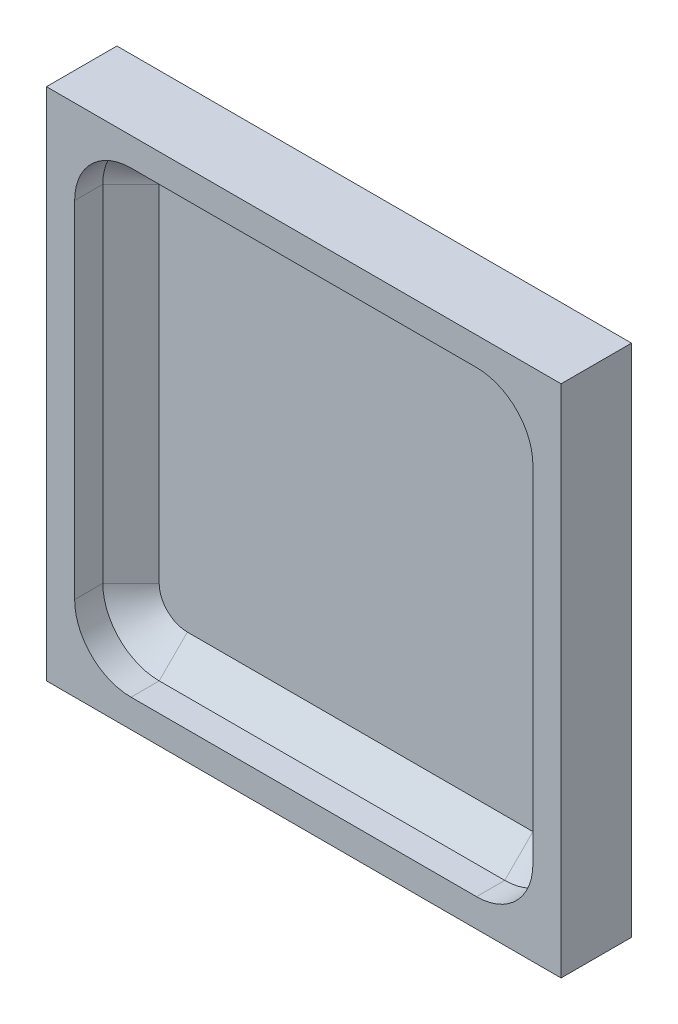
ISO-10303-21;
HEADER;
FILE_DESCRIPTION(('STEP AP214'),'2;1');
FILE_NAME('part.step','',(''),(''),'','','');
FILE_SCHEMA(('AUTOMOTIVE_DESIGN { 1 0 10303 214 1 1 1 1 }'));
ENDSEC;
DATA;
#1=APPLICATION_CONTEXT('core data for automotive mechanical design processes');
#2=APPLICATION_PROTOCOL_DEFINITION('international standard','automotive_design',2000,#1);
#3=PRODUCT_CONTEXT('',#1,'mechanical');
#4=PRODUCT('Part','Part','',(#3));
#5=PRODUCT_RELATED_PRODUCT_CATEGORY('part','',(#4));
#6=PRODUCT_DEFINITION_FORMATION('','',#4);
#7=PRODUCT_DEFINITION_CONTEXT('part definition',#1,'design');
#8=PRODUCT_DEFINITION('design','',#6,#7);
#9=PRODUCT_DEFINITION_SHAPE('','',#8);
#10=(LENGTH_UNIT() NAMED_UNIT(*) SI_UNIT(.MILLI.,.METRE.));
#11=(NAMED_UNIT(*) PLANE_ANGLE_UNIT() SI_UNIT($,.RADIAN.));
#12=(NAMED_UNIT(*) SI_UNIT($,.STERADIAN.) SOLID_ANGLE_UNIT());
#13=UNCERTAINTY_MEASURE_WITH_UNIT(LENGTH_MEASURE(1.E-05),#10,'distance_accuracy_value','');
#14=(GEOMETRIC_REPRESENTATION_CONTEXT(3) GLOBAL_UNCERTAINTY_ASSIGNED_CONTEXT((#13)) GLOBAL_UNIT_ASSIGNED_CONTEXT((#10,
#11,#12)) REPRESENTATION_CONTEXT('',''));
#15=CARTESIAN_POINT('',(0.,0.,0.));
#16=DIRECTION('',(0.,0.,1.));
#17=DIRECTION('',(1.,0.,0.));
#18=AXIS2_PLACEMENT_3D('',#15,#16,#17);
#19=CARTESIAN_POINT('',(-18.2634559672906,-18.2634559672906,-5.));
#20=DIRECTION('',(-1.,0.,0.));
#21=DIRECTION('',(0.,0.,1.));
#22=AXIS2_PLACEMENT_3D('',#19,#20,#21);
#23=PLANE('',#22);
#24=DIRECTION('',(0.,-1.,0.));
#25=VECTOR('',#24,1.);
#26=CARTESIAN_POINT('',(-18.2634559672906,-18.2634559672906,0.));
#27=LINE('',#26,#25);
#28=CARTESIAN_POINT('',(-18.2634559672906,18.2634559672906,0.));
#29=VERTEX_POINT('',#28);
#30=CARTESIAN_POINT('',(-18.2634559672906,-18.2634559672906,0.));
#31=VERTEX_POINT('',#30);
#32=EDGE_CURVE('E234',#29,#31,#27,.T.);
#33=ORIENTED_EDGE('',*,*,#32,.F.);
#34=DIRECTION('',(0.,0.,1.));
#35=VECTOR('',#34,1.);
#36=CARTESIAN_POINT('',(-18.2634559672906,18.2634559672906,-5.));
#37=LINE('',#36,#35);
#38=CARTESIAN_POINT('',(-18.2634559672906,18.2634559672906,-5.));
#39=VERTEX_POINT('',#38);
#40=EDGE_CURVE('E11',#39,#29,#37,.T.);
#41=ORIENTED_EDGE('',*,*,#40,.F.);
#42=DIRECTION('',(0.,-1.,0.));
#43=VECTOR('',#42,1.);
#44=CARTESIAN_POINT('',(-18.2634559672906,-18.2634559672906,-5.));
#45=LINE('',#44,#43);
#46=CARTESIAN_POINT('',(-18.2634559672906,-18.2634559672906,-5.));
#47=VERTEX_POINT('',#46);
#48=EDGE_CURVE('E257',#39,#47,#45,.T.);
#49=ORIENTED_EDGE('',*,*,#48,.T.);
#50=DIRECTION('',(0.,0.,1.));
#51=VECTOR('',#50,1.);
#52=CARTESIAN_POINT('',(-18.2634559672906,-18.2634559672906,-5.));
#53=LINE('',#52,#51);
#54=EDGE_CURVE('E38',#47,#31,#53,.T.);
#55=ORIENTED_EDGE('',*,*,#54,.T.);
#56=EDGE_LOOP('',(#33,#41,#49,#55));
#57=FACE_BOUND('',#56,.T.);
#58=ADVANCED_FACE('F35',(#57),#23,.T.);
#59=CARTESIAN_POINT('',(18.2634559672906,18.2634559672906,-5.));
#60=DIRECTION('',(0.,1.,0.));
#61=DIRECTION('',(0.,0.,1.));
#62=AXIS2_PLACEMENT_3D('',#59,#60,#61);
#63=PLANE('',#62);
#64=DIRECTION('',(-1.,0.,0.));
#65=VECTOR('',#64,1.);
#66=CARTESIAN_POINT('',(18.2634559672906,18.2634559672906,0.));
#67=LINE('',#66,#65);
#68=CARTESIAN_POINT('',(18.2634559672906,18.2634559672906,0.));
#69=VERTEX_POINT('',#68);
#70=EDGE_CURVE('E260',#69,#29,#67,.T.);
#71=ORIENTED_EDGE('',*,*,#70,.F.);
#72=DIRECTION('',(0.,0.,1.));
#73=VECTOR('',#72,1.);
#74=CARTESIAN_POINT('',(18.2634559672906,18.2634559672906,-5.));
#75=LINE('',#74,#73);
#76=CARTESIAN_POINT('',(18.2634559672906,18.2634559672906,-5.));
#77=VERTEX_POINT('',#76);
#78=EDGE_CURVE('E43',#77,#69,#75,.T.);
#79=ORIENTED_EDGE('',*,*,#78,.F.);
#80=DIRECTION('',(-1.,0.,0.));
#81=VECTOR('',#80,1.);
#82=CARTESIAN_POINT('',(18.2634559672906,18.2634559672906,-5.));
#83=LINE('',#82,#81);
#84=EDGE_CURVE('E265',#77,#39,#83,.T.);
#85=ORIENTED_EDGE('',*,*,#84,.T.);
#86=ORIENTED_EDGE('',*,*,#40,.T.);
#87=EDGE_LOOP('',(#71,#79,#85,#86));
#88=FACE_BOUND('',#87,.T.);
#89=ADVANCED_FACE('F280',(#88),#63,.T.);
#90=CARTESIAN_POINT('',(18.2634559672906,-18.2634559672906,-5.));
#91=DIRECTION('',(1.,0.,0.));
#92=DIRECTION('',(0.,0.,-1.));
#93=AXIS2_PLACEMENT_3D('',#90,#91,#92);
#94=PLANE('',#93);
#95=DIRECTION('',(0.,1.,0.));
#96=VECTOR('',#95,1.);
#97=CARTESIAN_POINT('',(18.2634559672906,-18.2634559672906,0.));
#98=LINE('',#97,#96);
#99=CARTESIAN_POINT('',(18.2634559672906,-18.2634559672906,0.));
#100=VERTEX_POINT('',#99);
#101=EDGE_CURVE('E272',#100,#69,#98,.T.);
#102=ORIENTED_EDGE('',*,*,#101,.F.);
#103=DIRECTION('',(0.,0.,1.));
#104=VECTOR('',#103,1.);
#105=CARTESIAN_POINT('',(18.2634559672906,-18.2634559672906,-5.));
#106=LINE('',#105,#104);
#107=CARTESIAN_POINT('',(18.2634559672906,-18.2634559672906,-5.));
#108=VERTEX_POINT('',#107);
#109=EDGE_CURVE('E277',#108,#100,#106,.T.);
#110=ORIENTED_EDGE('',*,*,#109,.F.);
#111=DIRECTION('',(0.,1.,0.));
#112=VECTOR('',#111,1.);
#113=CARTESIAN_POINT('',(18.2634559672906,-18.2634559672906,-5.));
#114=LINE('',#113,#112);
#115=EDGE_CURVE('E262',#108,#77,#114,.T.);
#116=ORIENTED_EDGE('',*,*,#115,.T.);
#117=ORIENTED_EDGE('',*,*,#78,.T.);
#118=EDGE_LOOP('',(#102,#110,#116,#117));
#119=FACE_BOUND('',#118,.T.);
#120=ADVANCED_FACE('F284',(#119),#94,.T.);
#121=CARTESIAN_POINT('',(18.2634559672906,-18.2634559672906,-5.));
#122=DIRECTION('',(0.,-1.,0.));
#123=DIRECTION('',(0.,0.,-1.));
#124=AXIS2_PLACEMENT_3D('',#121,#122,#123);
#125=PLANE('',#124);
#126=DIRECTION('',(1.,0.,0.));
#127=VECTOR('',#126,1.);
#128=CARTESIAN_POINT('',(18.2634559672906,-18.2634559672906,0.));
#129=LINE('',#128,#127);
#130=EDGE_CURVE('E269',#31,#100,#129,.T.);
#131=ORIENTED_EDGE('',*,*,#130,.F.);
#132=ORIENTED_EDGE('',*,*,#54,.F.);
#133=DIRECTION('',(1.,0.,0.));
#134=VECTOR('',#133,1.);
#135=CARTESIAN_POINT('',(18.2634559672906,-18.2634559672906,-5.));
#136=LINE('',#135,#134);
#137=EDGE_CURVE('E259',#47,#108,#136,.T.);
#138=ORIENTED_EDGE('',*,*,#137,.T.);
#139=ORIENTED_EDGE('',*,*,#109,.T.);
#140=EDGE_LOOP('',(#131,#132,#138,#139));
#141=FACE_BOUND('',#140,.T.);
#142=ADVANCED_FACE('F279',(#141),#125,.T.);
#143=CARTESIAN_POINT('',(0.,0.,-5.));
#144=DIRECTION('',(0.,0.,1.));
#145=DIRECTION('',(1.,0.,0.));
#146=AXIS2_PLACEMENT_3D('',#143,#144,#145);
#147=PLANE('',#146);
#148=ORIENTED_EDGE('',*,*,#48,.F.);
#149=ORIENTED_EDGE('',*,*,#84,.F.);
#150=ORIENTED_EDGE('',*,*,#115,.F.);
#151=ORIENTED_EDGE('',*,*,#137,.F.);
#152=EDGE_LOOP('',(#148,#149,#150,#151));
#153=FACE_BOUND('',#152,.T.);
#154=ADVANCED_FACE('F286',(#153),#147,.F.);
#155=CARTESIAN_POINT('',(0.,0.,0.));
#156=DIRECTION('',(0.,0.,1.));
#157=DIRECTION('',(1.,0.,0.));
#158=AXIS2_PLACEMENT_3D('',#155,#156,#157);
#159=PLANE('',#158);
#160=CARTESIAN_POINT('',(-12.2634559672906,-12.2634559672906,0.));
#161=DIRECTION('',(0.,0.,-1.));
#162=DIRECTION('',(-1.,0.,0.));
#163=AXIS2_PLACEMENT_3D('',#160,#161,#162);
#164=CIRCLE('',#163,4.);
#165=CARTESIAN_POINT('',(-16.2634559672906,-12.2634559672906,0.));
#166=VERTEX_POINT('',#165);
#167=CARTESIAN_POINT('',(-12.2634559672906,-16.2634559672906,0.));
#168=VERTEX_POINT('',#167);
#169=EDGE_CURVE('E183',#166,#168,#164,.F.);
#170=ORIENTED_EDGE('',*,*,#169,.F.);
#171=DIRECTION('',(0.,1.,0.));
#172=VECTOR('',#171,1.);
#173=CARTESIAN_POINT('',(-16.2634559672906,-16.2634559672906,0.));
#174=LINE('',#173,#172);
#175=CARTESIAN_POINT('',(-16.2634559672906,12.2634559672906,0.));
#176=VERTEX_POINT('',#175);
#177=EDGE_CURVE('E177',#166,#176,#174,.T.);
#178=ORIENTED_EDGE('',*,*,#177,.T.);
#179=CARTESIAN_POINT('',(-12.2634559672906,12.2634559672906,0.));
#180=DIRECTION('',(0.,0.,-1.));
#181=DIRECTION('',(-1.,0.,0.));
#182=AXIS2_PLACEMENT_3D('',#179,#180,#181);
#183=CIRCLE('',#182,4.);
#184=CARTESIAN_POINT('',(-12.2634559672906,16.2634559672906,0.));
#185=VERTEX_POINT('',#184);
#186=EDGE_CURVE('E187',#185,#176,#183,.F.);
#187=ORIENTED_EDGE('',*,*,#186,.F.);
#188=DIRECTION('',(1.,0.,0.));
#189=VECTOR('',#188,1.);
#190=CARTESIAN_POINT('',(-16.2634559672906,16.2634559672906,0.));
#191=LINE('',#190,#189);
#192=CARTESIAN_POINT('',(12.2634559672906,16.2634559672906,0.));
#193=VERTEX_POINT('',#192);
#194=EDGE_CURVE('E498',#185,#193,#191,.T.);
#195=ORIENTED_EDGE('',*,*,#194,.T.);
#196=CARTESIAN_POINT('',(12.2634559672906,12.2634559672906,0.));
#197=DIRECTION('',(0.,0.,-1.));
#198=DIRECTION('',(-1.,0.,0.));
#199=AXIS2_PLACEMENT_3D('',#196,#197,#198);
#200=CIRCLE('',#199,4.);
#201=CARTESIAN_POINT('',(16.2634559672906,12.2634559672906,0.));
#202=VERTEX_POINT('',#201);
#203=EDGE_CURVE('E167',#202,#193,#200,.F.);
#204=ORIENTED_EDGE('',*,*,#203,.F.);
#205=DIRECTION('',(0.,-1.,0.));
#206=VECTOR('',#205,1.);
#207=CARTESIAN_POINT('',(16.2634559672906,-16.2634559672906,0.));
#208=LINE('',#207,#206);
#209=CARTESIAN_POINT('',(16.2634559672906,-12.2634559672906,0.));
#210=VERTEX_POINT('',#209);
#211=EDGE_CURVE('E51',#202,#210,#208,.T.);
#212=ORIENTED_EDGE('',*,*,#211,.T.);
#213=CARTESIAN_POINT('',(12.2634559672906,-12.2634559672906,0.));
#214=DIRECTION('',(0.,0.,-1.));
#215=DIRECTION('',(-1.,0.,0.));
#216=AXIS2_PLACEMENT_3D('',#213,#214,#215);
#217=CIRCLE('',#216,4.);
#218=CARTESIAN_POINT('',(12.2634559672906,-16.2634559672906,0.));
#219=VERTEX_POINT('',#218);
#220=EDGE_CURVE('E162',#219,#210,#217,.F.);
#221=ORIENTED_EDGE('',*,*,#220,.F.);
#222=DIRECTION('',(-1.,0.,0.));
#223=VECTOR('',#222,1.);
#224=CARTESIAN_POINT('',(-16.2634559672906,-16.2634559672906,0.));
#225=LINE('',#224,#223);
#226=EDGE_CURVE('E172',#219,#168,#225,.T.);
#227=ORIENTED_EDGE('',*,*,#226,.T.);
#228=EDGE_LOOP('',(#170,#178,#187,#195,#204,#212,#221,#227));
#229=FACE_BOUND('',#228,.T.);
#230=ORIENTED_EDGE('',*,*,#32,.T.);
#231=ORIENTED_EDGE('',*,*,#130,.T.);
#232=ORIENTED_EDGE('',*,*,#101,.T.);
#233=ORIENTED_EDGE('',*,*,#70,.T.);
#234=EDGE_LOOP('',(#230,#231,#232,#233));
#235=FACE_BOUND('',#234,.T.);
#236=ADVANCED_FACE('F179',(#229,#235),#159,.T.);
#237=CARTESIAN_POINT('',(16.2634559672906,-16.2634559672906,-4.));
#238=DIRECTION('',(-1.,0.,0.));
#239=DIRECTION('',(0.,0.,1.));
#240=AXIS2_PLACEMENT_3D('',#237,#238,#239);
#241=PLANE('',#240);
#242=DIRECTION('',(0.,0.,1.));
#243=VECTOR('',#242,1.);
#244=CARTESIAN_POINT('',(16.2634559672906,-12.2634559672906,-4.));
#245=LINE('',#244,#243);
#246=CARTESIAN_POINT('',(16.2634559672906,-12.2634559672906,-2.));
#247=VERTEX_POINT('',#246);
#248=EDGE_CURVE('E185',#210,#247,#245,.F.);
#249=ORIENTED_EDGE('',*,*,#248,.F.);
#250=ORIENTED_EDGE('',*,*,#211,.F.);
#251=DIRECTION('',(0.,0.,1.));
#252=VECTOR('',#251,1.);
#253=CARTESIAN_POINT('',(16.2634559672906,12.2634559672906,-4.));
#254=LINE('',#253,#252);
#255=CARTESIAN_POINT('',(16.2634559672906,12.2634559672906,-2.));
#256=VERTEX_POINT('',#255);
#257=EDGE_CURVE('E182',#256,#202,#254,.T.);
#258=ORIENTED_EDGE('',*,*,#257,.F.);
#259=DIRECTION('',(0.,1.,0.));
#260=VECTOR('',#259,1.);
#261=CARTESIAN_POINT('',(16.2634559672906,12.2634559672906,-2.));
#262=LINE('',#261,#260);
#263=EDGE_CURVE('E226',#247,#256,#262,.T.);
#264=ORIENTED_EDGE('',*,*,#263,.F.);
#265=EDGE_LOOP('',(#249,#250,#258,#264));
#266=FACE_BOUND('',#265,.T.);
#267=ADVANCED_FACE('F293',(#266),#241,.T.);
#268=CARTESIAN_POINT('',(-16.2634559672906,-16.2634559672906,-4.));
#269=DIRECTION('',(0.,1.,0.));
#270=DIRECTION('',(1.,0.,0.));
#271=AXIS2_PLACEMENT_3D('',#268,#269,#270);
#272=PLANE('',#271);
#273=DIRECTION('',(0.,0.,1.));
#274=VECTOR('',#273,1.);
#275=CARTESIAN_POINT('',(-12.2634559672906,-16.2634559672906,-4.));
#276=LINE('',#275,#274);
#277=CARTESIAN_POINT('',(-12.2634559672906,-16.2634559672906,-2.));
#278=VERTEX_POINT('',#277);
#279=EDGE_CURVE('E168',#168,#278,#276,.F.);
#280=ORIENTED_EDGE('',*,*,#279,.F.);
#281=ORIENTED_EDGE('',*,*,#226,.F.);
#282=DIRECTION('',(0.,0.,1.));
#283=VECTOR('',#282,1.);
#284=CARTESIAN_POINT('',(12.2634559672906,-16.2634559672906,-4.));
#285=LINE('',#284,#283);
#286=CARTESIAN_POINT('',(12.2634559672906,-16.2634559672906,-2.));
#287=VERTEX_POINT('',#286);
#288=EDGE_CURVE('E157',#287,#219,#285,.T.);
#289=ORIENTED_EDGE('',*,*,#288,.F.);
#290=DIRECTION('',(1.,0.,0.));
#291=VECTOR('',#290,1.);
#292=CARTESIAN_POINT('',(12.2634559672906,-16.2634559672906,-2.));
#293=LINE('',#292,#291);
#294=EDGE_CURVE('E219',#278,#287,#293,.T.);
#295=ORIENTED_EDGE('',*,*,#294,.F.);
#296=EDGE_LOOP('',(#280,#281,#289,#295));
#297=FACE_BOUND('',#296,.T.);
#298=ADVANCED_FACE('F173',(#297),#272,.T.);
#299=CARTESIAN_POINT('',(-16.2634559672906,-16.2634559672906,-4.));
#300=DIRECTION('',(1.,0.,0.));
#301=DIRECTION('',(0.,0.,-1.));
#302=AXIS2_PLACEMENT_3D('',#299,#300,#301);
#303=PLANE('',#302);
#304=DIRECTION('',(0.,0.,1.));
#305=VECTOR('',#304,1.);
#306=CARTESIAN_POINT('',(-16.2634559672906,12.2634559672906,-4.));
#307=LINE('',#306,#305);
#308=CARTESIAN_POINT('',(-16.2634559672906,12.2634559672906,-2.));
#309=VERTEX_POINT('',#308);
#310=EDGE_CURVE('E192',#176,#309,#307,.F.);
#311=ORIENTED_EDGE('',*,*,#310,.F.);
#312=ORIENTED_EDGE('',*,*,#177,.F.);
#313=DIRECTION('',(0.,0.,1.));
#314=VECTOR('',#313,1.);
#315=CARTESIAN_POINT('',(-16.2634559672906,-12.2634559672906,-4.));
#316=LINE('',#315,#314);
#317=CARTESIAN_POINT('',(-16.2634559672906,-12.2634559672906,-2.));
#318=VERTEX_POINT('',#317);
#319=EDGE_CURVE('E195',#318,#166,#316,.T.);
#320=ORIENTED_EDGE('',*,*,#319,.F.);
#321=DIRECTION('',(0.,-1.,0.));
#322=VECTOR('',#321,1.);
#323=CARTESIAN_POINT('',(-16.2634559672906,-12.2634559672906,-2.));
#324=LINE('',#323,#322);
#325=EDGE_CURVE('E224',#309,#318,#324,.T.);
#326=ORIENTED_EDGE('',*,*,#325,.F.);
#327=EDGE_LOOP('',(#311,#312,#320,#326));
#328=FACE_BOUND('',#327,.T.);
#329=ADVANCED_FACE('F338',(#328),#303,.T.);
#330=CARTESIAN_POINT('',(-16.2634559672906,16.2634559672906,-4.));
#331=DIRECTION('',(0.,-1.,0.));
#332=DIRECTION('',(-1.,0.,0.));
#333=AXIS2_PLACEMENT_3D('',#330,#331,#332);
#334=PLANE('',#333);
#335=DIRECTION('',(0.,0.,1.));
#336=VECTOR('',#335,1.);
#337=CARTESIAN_POINT('',(12.2634559672906,16.2634559672906,-4.));
#338=LINE('',#337,#336);
#339=CARTESIAN_POINT('',(12.2634559672906,16.2634559672906,-2.));
#340=VERTEX_POINT('',#339);
#341=EDGE_CURVE('E197',#193,#340,#338,.F.);
#342=ORIENTED_EDGE('',*,*,#341,.F.);
#343=ORIENTED_EDGE('',*,*,#194,.F.);
#344=DIRECTION('',(0.,0.,1.));
#345=VECTOR('',#344,1.);
#346=CARTESIAN_POINT('',(-12.2634559672906,16.2634559672906,-4.));
#347=LINE('',#346,#345);
#348=CARTESIAN_POINT('',(-12.2634559672906,16.2634559672906,-2.));
#349=VERTEX_POINT('',#348);
#350=EDGE_CURVE('E200',#349,#185,#347,.T.);
#351=ORIENTED_EDGE('',*,*,#350,.F.);
#352=DIRECTION('',(-1.,0.,0.));
#353=VECTOR('',#352,1.);
#354=CARTESIAN_POINT('',(-12.2634559672906,16.2634559672906,-2.));
#355=LINE('',#354,#353);
#356=EDGE_CURVE('E232',#340,#349,#355,.T.);
#357=ORIENTED_EDGE('',*,*,#356,.F.);
#358=EDGE_LOOP('',(#342,#343,#351,#357));
#359=FACE_BOUND('',#358,.T.);
#360=ADVANCED_FACE('F347',(#359),#334,.T.);
#361=CARTESIAN_POINT('',(0.,0.,-4.));
#362=DIRECTION('',(0.,0.,-1.));
#363=DIRECTION('',(-1.,0.,0.));
#364=AXIS2_PLACEMENT_3D('',#361,#362,#363);
#365=PLANE('',#364);
#366=CARTESIAN_POINT('',(12.2634559672906,-12.2634559672906,-4.));
#367=DIRECTION('',(0.,0.,-1.));
#368=DIRECTION('',(-1.,0.,0.));
#369=AXIS2_PLACEMENT_3D('',#366,#367,#368);
#370=CIRCLE('',#369,2.00000000000001);
#371=CARTESIAN_POINT('',(14.2634559672906,-12.2634559672906,-4.));
#372=VERTEX_POINT('',#371);
#373=CARTESIAN_POINT('',(12.2634559672906,-14.2634559672906,-4.));
#374=VERTEX_POINT('',#373);
#375=EDGE_CURVE('E212',#372,#374,#370,.T.);
#376=ORIENTED_EDGE('',*,*,#375,.F.);
#377=DIRECTION('',(0.,-1.,0.));
#378=VECTOR('',#377,1.);
#379=CARTESIAN_POINT('',(14.2634559672906,-12.2634559672906,-4.));
#380=LINE('',#379,#378);
#381=CARTESIAN_POINT('',(14.2634559672906,12.2634559672906,-4.));
#382=VERTEX_POINT('',#381);
#383=EDGE_CURVE('E208',#382,#372,#380,.T.);
#384=ORIENTED_EDGE('',*,*,#383,.F.);
#385=CARTESIAN_POINT('',(12.2634559672906,12.2634559672906,-4.));
#386=DIRECTION('',(0.,0.,-1.));
#387=DIRECTION('',(-1.,0.,0.));
#388=AXIS2_PLACEMENT_3D('',#385,#386,#387);
#389=CIRCLE('',#388,2.00000000000001);
#390=CARTESIAN_POINT('',(12.2634559672906,14.2634559672906,-4.));
#391=VERTEX_POINT('',#390);
#392=EDGE_CURVE('E204',#391,#382,#389,.T.);
#393=ORIENTED_EDGE('',*,*,#392,.F.);
#394=DIRECTION('',(1.,0.,0.));
#395=VECTOR('',#394,1.);
#396=CARTESIAN_POINT('',(12.2634559672906,14.2634559672906,-4.));
#397=LINE('',#396,#395);
#398=CARTESIAN_POINT('',(-12.2634559672906,14.2634559672906,-4.));
#399=VERTEX_POINT('',#398);
#400=EDGE_CURVE('E202',#399,#391,#397,.T.);
#401=ORIENTED_EDGE('',*,*,#400,.F.);
#402=CARTESIAN_POINT('',(-12.2634559672906,12.2634559672906,-4.));
#403=DIRECTION('',(0.,0.,-1.));
#404=DIRECTION('',(-1.,0.,0.));
#405=AXIS2_PLACEMENT_3D('',#402,#403,#404);
#406=CIRCLE('',#405,2.00000000000001);
#407=CARTESIAN_POINT('',(-14.2634559672906,12.2634559672906,-4.));
#408=VERTEX_POINT('',#407);
#409=EDGE_CURVE('E206',#408,#399,#406,.T.);
#410=ORIENTED_EDGE('',*,*,#409,.F.);
#411=DIRECTION('',(0.,1.,0.));
#412=VECTOR('',#411,1.);
#413=CARTESIAN_POINT('',(-14.2634559672906,12.2634559672906,-4.));
#414=LINE('',#413,#412);
#415=CARTESIAN_POINT('',(-14.2634559672906,-12.2634559672906,-4.));
#416=VERTEX_POINT('',#415);
#417=EDGE_CURVE('E210',#416,#408,#414,.T.);
#418=ORIENTED_EDGE('',*,*,#417,.F.);
#419=CARTESIAN_POINT('',(-12.2634559672906,-12.2634559672906,-4.));
#420=DIRECTION('',(0.,0.,-1.));
#421=DIRECTION('',(-1.,0.,0.));
#422=AXIS2_PLACEMENT_3D('',#419,#420,#421);
#423=CIRCLE('',#422,2.00000000000001);
#424=CARTESIAN_POINT('',(-12.2634559672906,-14.2634559672906,-4.));
#425=VERTEX_POINT('',#424);
#426=EDGE_CURVE('E214',#425,#416,#423,.T.);
#427=ORIENTED_EDGE('',*,*,#426,.F.);
#428=DIRECTION('',(-1.,0.,0.));
#429=VECTOR('',#428,1.);
#430=CARTESIAN_POINT('',(-12.2634559672906,-14.2634559672906,-4.));
#431=LINE('',#430,#429);
#432=EDGE_CURVE('E216',#374,#425,#431,.T.);
#433=ORIENTED_EDGE('',*,*,#432,.F.);
#434=EDGE_LOOP('',(#376,#384,#393,#401,#410,#418,#427,#433));
#435=FACE_BOUND('',#434,.T.);
#436=ADVANCED_FACE('F357',(#435),#365,.F.);
#437=CARTESIAN_POINT('',(12.2634559672906,-12.2634559672906,-4.));
#438=DIRECTION('',(0.,0.,1.));
#439=DIRECTION('',(1.,0.,0.));
#440=AXIS2_PLACEMENT_3D('',#437,#438,#439);
#441=CYLINDRICAL_SURFACE('',#440,4.);
#442=ORIENTED_EDGE('',*,*,#288,.T.);
#443=ORIENTED_EDGE('',*,*,#220,.T.);
#444=ORIENTED_EDGE('',*,*,#248,.T.);
#445=CARTESIAN_POINT('',(12.2634559672906,-12.2634559672906,-2.));
#446=DIRECTION('',(0.,0.,-1.));
#447=DIRECTION('',(-1.,0.,0.));
#448=AXIS2_PLACEMENT_3D('',#445,#446,#447);
#449=CIRCLE('',#448,4.);
#450=EDGE_CURVE('E163',#287,#247,#449,.F.);
#451=ORIENTED_EDGE('',*,*,#450,.F.);
#452=EDGE_LOOP('',(#442,#443,#444,#451));
#453=FACE_BOUND('',#452,.T.);
#454=ADVANCED_FACE('F159',(#453),#441,.F.);
#455=CARTESIAN_POINT('',(-12.2634559672906,-12.2634559672906,-4.));
#456=DIRECTION('',(0.,0.,1.));
#457=DIRECTION('',(1.,0.,0.));
#458=AXIS2_PLACEMENT_3D('',#455,#456,#457);
#459=CYLINDRICAL_SURFACE('',#458,4.);
#460=ORIENTED_EDGE('',*,*,#319,.T.);
#461=ORIENTED_EDGE('',*,*,#169,.T.);
#462=ORIENTED_EDGE('',*,*,#279,.T.);
#463=CARTESIAN_POINT('',(-12.2634559672906,-12.2634559672906,-2.));
#464=DIRECTION('',(0.,0.,-1.));
#465=DIRECTION('',(-1.,0.,0.));
#466=AXIS2_PLACEMENT_3D('',#463,#464,#465);
#467=CIRCLE('',#466,4.);
#468=EDGE_CURVE('E221',#318,#278,#467,.F.);
#469=ORIENTED_EDGE('',*,*,#468,.F.);
#470=EDGE_LOOP('',(#460,#461,#462,#469));
#471=FACE_BOUND('',#470,.T.);
#472=ADVANCED_FACE('F376',(#471),#459,.F.);
#473=CARTESIAN_POINT('',(-12.2634559672906,12.2634559672906,-4.));
#474=DIRECTION('',(0.,0.,1.));
#475=DIRECTION('',(1.,0.,0.));
#476=AXIS2_PLACEMENT_3D('',#473,#474,#475);
#477=CYLINDRICAL_SURFACE('',#476,4.);
#478=ORIENTED_EDGE('',*,*,#350,.T.);
#479=ORIENTED_EDGE('',*,*,#186,.T.);
#480=ORIENTED_EDGE('',*,*,#310,.T.);
#481=CARTESIAN_POINT('',(-12.2634559672906,12.2634559672906,-2.));
#482=DIRECTION('',(0.,0.,-1.));
#483=DIRECTION('',(-1.,0.,0.));
#484=AXIS2_PLACEMENT_3D('',#481,#482,#483);
#485=CIRCLE('',#484,4.);
#486=EDGE_CURVE('E228',#349,#309,#485,.F.);
#487=ORIENTED_EDGE('',*,*,#486,.F.);
#488=EDGE_LOOP('',(#478,#479,#480,#487));
#489=FACE_BOUND('',#488,.T.);
#490=ADVANCED_FACE('F385',(#489),#477,.F.);
#491=CARTESIAN_POINT('',(12.2634559672906,12.2634559672906,-4.));
#492=DIRECTION('',(0.,0.,1.));
#493=DIRECTION('',(1.,0.,0.));
#494=AXIS2_PLACEMENT_3D('',#491,#492,#493);
#495=CYLINDRICAL_SURFACE('',#494,4.);
#496=ORIENTED_EDGE('',*,*,#257,.T.);
#497=ORIENTED_EDGE('',*,*,#203,.T.);
#498=ORIENTED_EDGE('',*,*,#341,.T.);
#499=CARTESIAN_POINT('',(12.2634559672906,12.2634559672906,-2.));
#500=DIRECTION('',(0.,0.,-1.));
#501=DIRECTION('',(-1.,0.,0.));
#502=AXIS2_PLACEMENT_3D('',#499,#500,#501);
#503=CIRCLE('',#502,4.);
#504=EDGE_CURVE('E230',#256,#340,#503,.F.);
#505=ORIENTED_EDGE('',*,*,#504,.F.);
#506=EDGE_LOOP('',(#496,#497,#498,#505));
#507=FACE_BOUND('',#506,.T.);
#508=ADVANCED_FACE('F395',(#507),#495,.F.);
#509=CARTESIAN_POINT('',(0.,14.2634559672906,-4.));
#510=DIRECTION('',(0.,0.70710678118655,-0.707106781186545));
#511=DIRECTION('',(-1.,0.,0.));
#512=AXIS2_PLACEMENT_3D('',#509,#510,#511);
#513=PLANE('',#512);
#514=DIRECTION('',(0.,-0.707106781186545,-0.70710678118655));
#515=VECTOR('',#514,1.);
#516=CARTESIAN_POINT('',(-12.2634559672906,16.2634559672906,-2.));
#517=LINE('',#516,#515);
#518=EDGE_CURVE('E251',#349,#399,#517,.T.);
#519=ORIENTED_EDGE('',*,*,#518,.T.);
#520=ORIENTED_EDGE('',*,*,#400,.T.);
#521=DIRECTION('',(0.,0.707106781186545,0.70710678118655));
#522=VECTOR('',#521,1.);
#523=CARTESIAN_POINT('',(12.2634559672906,14.2634559672906,-4.));
#524=LINE('',#523,#522);
#525=EDGE_CURVE('E254',#391,#340,#524,.T.);
#526=ORIENTED_EDGE('',*,*,#525,.T.);
#527=ORIENTED_EDGE('',*,*,#356,.T.);
#528=EDGE_LOOP('',(#519,#520,#526,#527));
#529=FACE_BOUND('',#528,.T.);
#530=ADVANCED_FACE('F405',(#529),#513,.F.);
#531=CARTESIAN_POINT('',(12.2634559672906,12.2634559672906,-4.));
#532=DIRECTION('',(0.,0.,1.));
#533=DIRECTION('',(1.,0.,0.));
#534=AXIS2_PLACEMENT_3D('',#531,#532,#533);
#535=CONICAL_SURFACE('',#534,2.00000000000001,0.785398163397445);
#536=ORIENTED_EDGE('',*,*,#525,.F.);
#537=ORIENTED_EDGE('',*,*,#392,.T.);
#538=DIRECTION('',(0.707106781186545,0.,0.70710678118655));
#539=VECTOR('',#538,1.);
#540=CARTESIAN_POINT('',(14.2634559672906,12.2634559672906,-4.));
#541=LINE('',#540,#539);
#542=EDGE_CURVE('E248',#382,#256,#541,.T.);
#543=ORIENTED_EDGE('',*,*,#542,.T.);
#544=ORIENTED_EDGE('',*,*,#504,.T.);
#545=EDGE_LOOP('',(#536,#537,#543,#544));
#546=FACE_BOUND('',#545,.T.);
#547=ADVANCED_FACE('F415',(#546),#535,.F.);
#548=CARTESIAN_POINT('',(-12.2634559672906,12.2634559672906,-4.));
#549=DIRECTION('',(0.,0.,1.));
#550=DIRECTION('',(1.,0.,0.));
#551=AXIS2_PLACEMENT_3D('',#548,#549,#550);
#552=CONICAL_SURFACE('',#551,2.00000000000001,0.785398163397445);
#553=ORIENTED_EDGE('',*,*,#518,.F.);
#554=ORIENTED_EDGE('',*,*,#486,.T.);
#555=DIRECTION('',(0.707106781186545,0.,-0.70710678118655));
#556=VECTOR('',#555,1.);
#557=CARTESIAN_POINT('',(-16.2634559672906,12.2634559672906,-2.));
#558=LINE('',#557,#556);
#559=EDGE_CURVE('E245',#309,#408,#558,.T.);
#560=ORIENTED_EDGE('',*,*,#559,.T.);
#561=ORIENTED_EDGE('',*,*,#409,.T.);
#562=EDGE_LOOP('',(#553,#554,#560,#561));
#563=FACE_BOUND('',#562,.T.);
#564=ADVANCED_FACE('F424',(#563),#552,.F.);
#565=CARTESIAN_POINT('',(14.2634559672906,0.,-4.));
#566=DIRECTION('',(0.70710678118655,0.,-0.707106781186545));
#567=DIRECTION('',(0.,1.,0.));
#568=AXIS2_PLACEMENT_3D('',#565,#566,#567);
#569=PLANE('',#568);
#570=ORIENTED_EDGE('',*,*,#542,.F.);
#571=ORIENTED_EDGE('',*,*,#383,.T.);
#572=DIRECTION('',(0.707106781186545,0.,0.70710678118655));
#573=VECTOR('',#572,1.);
#574=CARTESIAN_POINT('',(14.2634559672906,-12.2634559672906,-4.));
#575=LINE('',#574,#573);
#576=EDGE_CURVE('E242',#372,#247,#575,.T.);
#577=ORIENTED_EDGE('',*,*,#576,.T.);
#578=ORIENTED_EDGE('',*,*,#263,.T.);
#579=EDGE_LOOP('',(#570,#571,#577,#578));
#580=FACE_BOUND('',#579,.T.);
#581=ADVANCED_FACE('F434',(#580),#569,.F.);
#582=CARTESIAN_POINT('',(-14.2634559672906,0.,-4.));
#583=DIRECTION('',(-0.70710678118655,0.,-0.707106781186545));
#584=DIRECTION('',(0.,-1.,0.));
#585=AXIS2_PLACEMENT_3D('',#582,#583,#584);
#586=PLANE('',#585);
#587=ORIENTED_EDGE('',*,*,#559,.F.);
#588=ORIENTED_EDGE('',*,*,#325,.T.);
#589=DIRECTION('',(0.707106781186545,0.,-0.70710678118655));
#590=VECTOR('',#589,1.);
#591=CARTESIAN_POINT('',(-16.2634559672906,-12.2634559672906,-2.));
#592=LINE('',#591,#590);
#593=EDGE_CURVE('E239',#318,#416,#592,.T.);
#594=ORIENTED_EDGE('',*,*,#593,.T.);
#595=ORIENTED_EDGE('',*,*,#417,.T.);
#596=EDGE_LOOP('',(#587,#588,#594,#595));
#597=FACE_BOUND('',#596,.T.);
#598=ADVANCED_FACE('F444',(#597),#586,.F.);
#599=CARTESIAN_POINT('',(12.2634559672906,-12.2634559672906,-4.));
#600=DIRECTION('',(0.,0.,1.));
#601=DIRECTION('',(1.,0.,0.));
#602=AXIS2_PLACEMENT_3D('',#599,#600,#601);
#603=CONICAL_SURFACE('',#602,2.00000000000001,0.785398163397445);
#604=ORIENTED_EDGE('',*,*,#576,.F.);
#605=ORIENTED_EDGE('',*,*,#375,.T.);
#606=DIRECTION('',(0.,-0.707106781186545,0.70710678118655));
#607=VECTOR('',#606,1.);
#608=CARTESIAN_POINT('',(12.2634559672906,-14.2634559672906,-4.));
#609=LINE('',#608,#607);
#610=EDGE_CURVE('E237',#374,#287,#609,.T.);
#611=ORIENTED_EDGE('',*,*,#610,.T.);
#612=ORIENTED_EDGE('',*,*,#450,.T.);
#613=EDGE_LOOP('',(#604,#605,#611,#612));
#614=FACE_BOUND('',#613,.T.);
#615=ADVANCED_FACE('F454',(#614),#603,.F.);
#616=CARTESIAN_POINT('',(-12.2634559672906,-12.2634559672906,-4.));
#617=DIRECTION('',(0.,0.,1.));
#618=DIRECTION('',(1.,0.,0.));
#619=AXIS2_PLACEMENT_3D('',#616,#617,#618);
#620=CONICAL_SURFACE('',#619,2.00000000000001,0.785398163397445);
#621=ORIENTED_EDGE('',*,*,#593,.F.);
#622=ORIENTED_EDGE('',*,*,#468,.T.);
#623=DIRECTION('',(0.,0.707106781186545,-0.70710678118655));
#624=VECTOR('',#623,1.);
#625=CARTESIAN_POINT('',(-12.2634559672906,-16.2634559672906,-2.));
#626=LINE('',#625,#624);
#627=EDGE_CURVE('E235',#278,#425,#626,.T.);
#628=ORIENTED_EDGE('',*,*,#627,.T.);
#629=ORIENTED_EDGE('',*,*,#426,.T.);
#630=EDGE_LOOP('',(#621,#622,#628,#629));
#631=FACE_BOUND('',#630,.T.);
#632=ADVANCED_FACE('F464',(#631),#620,.F.);
#633=CARTESIAN_POINT('',(0.,-14.2634559672906,-4.));
#634=DIRECTION('',(0.,-0.70710678118655,-0.707106781186545));
#635=DIRECTION('',(1.,0.,0.));
#636=AXIS2_PLACEMENT_3D('',#633,#634,#635);
#637=PLANE('',#636);
#638=ORIENTED_EDGE('',*,*,#610,.F.);
#639=ORIENTED_EDGE('',*,*,#432,.T.);
#640=ORIENTED_EDGE('',*,*,#627,.F.);
#641=ORIENTED_EDGE('',*,*,#294,.T.);
#642=EDGE_LOOP('',(#638,#639,#640,#641));
#643=FACE_BOUND('',#642,.T.);
#644=ADVANCED_FACE('F474',(#643),#637,.F.);
#645=CLOSED_SHELL('',(#58,#89,#120,#142,#154,#236,#267,#298,#329,#360,#436,#454,#472,#490,#508,
#530,#547,#564,#581,#598,#615,#632,#644));
#646=MANIFOLD_SOLID_BREP('B2',#645);
#647=ADVANCED_BREP_SHAPE_REPRESENTATION('',(#18,#646),#14);
#648=SHAPE_DEFINITION_REPRESENTATION(#9,#647);
ENDSEC;
END-ISO-10303-21;
